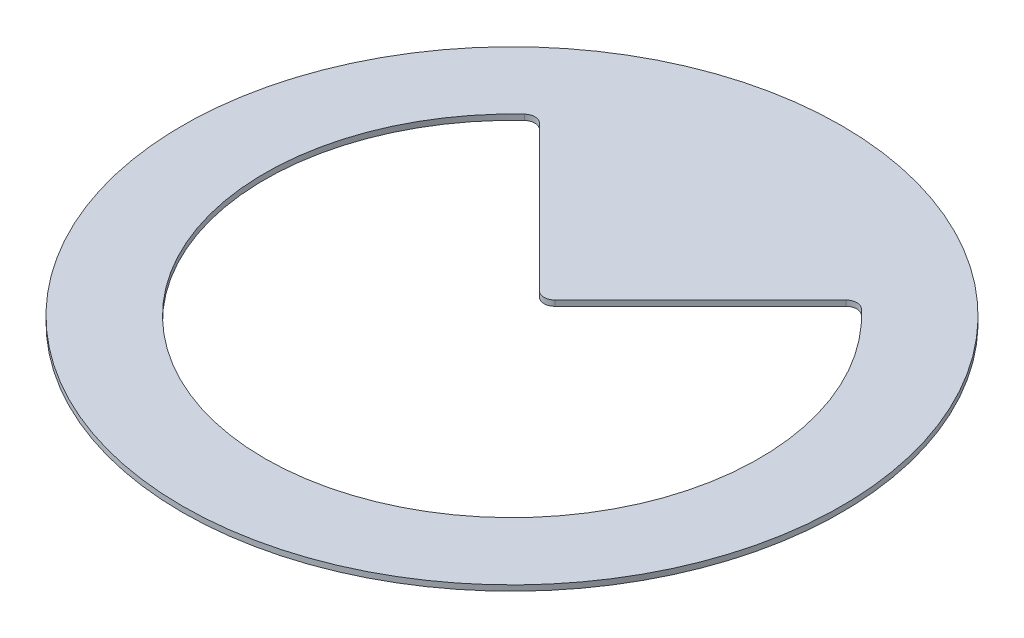
ISO-10303-21;
HEADER;
FILE_DESCRIPTION(('STEP AP214'),'2;1');
FILE_NAME('part.step','',(''),(''),'','','');
FILE_SCHEMA(('AUTOMOTIVE_DESIGN { 1 0 10303 214 1 1 1 1 }'));
ENDSEC;
DATA;
#1=APPLICATION_CONTEXT('core data for automotive mechanical design processes');
#2=APPLICATION_PROTOCOL_DEFINITION('international standard','automotive_design',2000,#1);
#3=PRODUCT_CONTEXT('',#1,'mechanical');
#4=PRODUCT('Part','Part','',(#3));
#5=PRODUCT_RELATED_PRODUCT_CATEGORY('part','',(#4));
#6=PRODUCT_DEFINITION_FORMATION('','',#4);
#7=PRODUCT_DEFINITION_CONTEXT('part definition',#1,'design');
#8=PRODUCT_DEFINITION('design','',#6,#7);
#9=PRODUCT_DEFINITION_SHAPE('','',#8);
#10=(LENGTH_UNIT() NAMED_UNIT(*) SI_UNIT(.MILLI.,.METRE.));
#11=(NAMED_UNIT(*) PLANE_ANGLE_UNIT() SI_UNIT($,.RADIAN.));
#12=(NAMED_UNIT(*) SI_UNIT($,.STERADIAN.) SOLID_ANGLE_UNIT());
#13=UNCERTAINTY_MEASURE_WITH_UNIT(LENGTH_MEASURE(1.E-05),#10,'distance_accuracy_value','');
#14=(GEOMETRIC_REPRESENTATION_CONTEXT(3) GLOBAL_UNCERTAINTY_ASSIGNED_CONTEXT((#13)) GLOBAL_UNIT_ASSIGNED_CONTEXT((#10,
#11,#12)) REPRESENTATION_CONTEXT('',''));
#15=CARTESIAN_POINT('',(0.,0.,0.));
#16=DIRECTION('',(0.,0.,1.));
#17=DIRECTION('',(1.,0.,0.));
#18=AXIS2_PLACEMENT_3D('',#15,#16,#17);
#19=CARTESIAN_POINT('',(0.,1.,0.));
#20=DIRECTION('',(0.,1.,0.));
#21=DIRECTION('',(0.,0.,1.));
#22=AXIS2_PLACEMENT_3D('',#19,#20,#21);
#23=PLANE('',#22);
#24=CARTESIAN_POINT('',(0.,1.,0.));
#25=DIRECTION('',(0.,1.,0.));
#26=DIRECTION('',(0.,0.,1.));
#27=AXIS2_PLACEMENT_3D('',#24,#25,#26);
#28=CIRCLE('',#27,60.);
#29=CARTESIAN_POINT('',(0.,1.,60.));
#30=VERTEX_POINT('',#29);
#31=EDGE_CURVE('E108',#30,#30,#28,.T.);
#32=ORIENTED_EDGE('',*,*,#31,.T.);
#33=EDGE_LOOP('',(#32));
#34=FACE_BOUND('',#33,.T.);
#35=DIRECTION('',(-0.707106781186547,0.,-0.707106781186548));
#36=VECTOR('',#35,1.);
#37=CARTESIAN_POINT('',(-29.2214438511238,1.,-34.2214438511238));
#38=LINE('',#37,#36);
#39=CARTESIAN_POINT('',(-1.41421356237309,1.,-6.4142135623731));
#40=VERTEX_POINT('',#39);
#41=CARTESIAN_POINT('',(-27.8861986403674,1.,-32.8861986403674));
#42=VERTEX_POINT('',#41);
#43=EDGE_CURVE('E145',#40,#42,#38,.T.);
#44=ORIENTED_EDGE('',*,*,#43,.F.);
#45=CARTESIAN_POINT('',(0.,1.,-7.82842712474619));
#46=DIRECTION('',(0.,1.,0.));
#47=DIRECTION('',(0.,0.,1.));
#48=AXIS2_PLACEMENT_3D('',#45,#46,#47);
#49=CIRCLE('',#48,2.);
#50=CARTESIAN_POINT('',(1.4142135623731,1.,-6.4142135623731));
#51=VERTEX_POINT('',#50);
#52=EDGE_CURVE('E50',#40,#51,#49,.T.);
#53=ORIENTED_EDGE('',*,*,#52,.T.);
#54=DIRECTION('',(-0.707106781186546,0.,0.707106781186549));
#55=VECTOR('',#54,1.);
#56=CARTESIAN_POINT('',(0.,1.,-5.));
#57=LINE('',#56,#55);
#58=CARTESIAN_POINT('',(27.8861986403674,1.,-32.8861986403674));
#59=VERTEX_POINT('',#58);
#60=EDGE_CURVE('E140',#59,#51,#57,.T.);
#61=ORIENTED_EDGE('',*,*,#60,.F.);
#62=CARTESIAN_POINT('',(29.3004122027405,1.,-31.4719850779943));
#63=DIRECTION('',(0.,1.,0.));
#64=DIRECTION('',(0.,0.,1.));
#65=AXIS2_PLACEMENT_3D('',#62,#63,#64);
#66=CIRCLE('',#65,2.);
#67=CARTESIAN_POINT('',(30.6632220726354,1.,-32.9357983374359));
#68=VERTEX_POINT('',#67);
#69=EDGE_CURVE('E11',#59,#68,#66,.F.);
#70=ORIENTED_EDGE('',*,*,#69,.T.);
#71=CARTESIAN_POINT('',(0.,1.,0.));
#72=DIRECTION('',(0.,1.,0.));
#73=DIRECTION('',(0.,0.,1.));
#74=AXIS2_PLACEMENT_3D('',#71,#72,#73);
#75=CIRCLE('',#74,45.);
#76=CARTESIAN_POINT('',(-30.6632220726354,1.,-32.935798337436));
#77=VERTEX_POINT('',#76);
#78=EDGE_CURVE('E106',#77,#68,#75,.T.);
#79=ORIENTED_EDGE('',*,*,#78,.F.);
#80=CARTESIAN_POINT('',(-29.3004122027405,1.,-31.4719850779944));
#81=DIRECTION('',(0.,1.,0.));
#82=DIRECTION('',(0.,0.,1.));
#83=AXIS2_PLACEMENT_3D('',#80,#81,#82);
#84=CIRCLE('',#83,2.);
#85=EDGE_CURVE('E127',#77,#42,#84,.F.);
#86=ORIENTED_EDGE('',*,*,#85,.T.);
#87=EDGE_LOOP('',(#44,#53,#61,#70,#79,#86));
#88=FACE_BOUND('',#87,.T.);
#89=ADVANCED_FACE('F35',(#34,#88),#23,.T.);
#90=CARTESIAN_POINT('',(0.,0.,0.));
#91=DIRECTION('',(0.,1.,0.));
#92=DIRECTION('',(0.,0.,1.));
#93=AXIS2_PLACEMENT_3D('',#90,#91,#92);
#94=PLANE('',#93);
#95=CARTESIAN_POINT('',(0.,0.,0.));
#96=DIRECTION('',(0.,1.,0.));
#97=DIRECTION('',(0.,0.,1.));
#98=AXIS2_PLACEMENT_3D('',#95,#96,#97);
#99=CIRCLE('',#98,60.);
#100=CARTESIAN_POINT('',(0.,0.,60.));
#101=VERTEX_POINT('',#100);
#102=EDGE_CURVE('E113',#101,#101,#99,.T.);
#103=ORIENTED_EDGE('',*,*,#102,.F.);
#104=EDGE_LOOP('',(#103));
#105=FACE_BOUND('',#104,.T.);
#106=DIRECTION('',(-0.707106781186546,0.,0.707106781186549));
#107=VECTOR('',#106,1.);
#108=CARTESIAN_POINT('',(0.,0.,-5.));
#109=LINE('',#108,#107);
#110=CARTESIAN_POINT('',(27.8861986403674,0.,-32.8861986403674));
#111=VERTEX_POINT('',#110);
#112=CARTESIAN_POINT('',(1.4142135623731,0.,-6.4142135623731));
#113=VERTEX_POINT('',#112);
#114=EDGE_CURVE('E93',#111,#113,#109,.T.);
#115=ORIENTED_EDGE('',*,*,#114,.T.);
#116=CARTESIAN_POINT('',(0.,0.,-7.82842712474619));
#117=DIRECTION('',(0.,1.,0.));
#118=DIRECTION('',(0.,0.,1.));
#119=AXIS2_PLACEMENT_3D('',#116,#117,#118);
#120=CIRCLE('',#119,2.);
#121=CARTESIAN_POINT('',(-1.41421356237309,0.,-6.4142135623731));
#122=VERTEX_POINT('',#121);
#123=EDGE_CURVE('E89',#113,#122,#120,.F.);
#124=ORIENTED_EDGE('',*,*,#123,.T.);
#125=DIRECTION('',(-0.707106781186547,0.,-0.707106781186548));
#126=VECTOR('',#125,1.);
#127=CARTESIAN_POINT('',(-29.2214438511238,0.,-34.2214438511238));
#128=LINE('',#127,#126);
#129=CARTESIAN_POINT('',(-27.8861986403674,0.,-32.8861986403674));
#130=VERTEX_POINT('',#129);
#131=EDGE_CURVE('E92',#122,#130,#128,.T.);
#132=ORIENTED_EDGE('',*,*,#131,.T.);
#133=CARTESIAN_POINT('',(-29.3004122027405,0.,-31.4719850779944));
#134=DIRECTION('',(0.,1.,0.));
#135=DIRECTION('',(0.,0.,1.));
#136=AXIS2_PLACEMENT_3D('',#133,#134,#135);
#137=CIRCLE('',#136,2.);
#138=CARTESIAN_POINT('',(-30.6632220726354,0.,-32.935798337436));
#139=VERTEX_POINT('',#138);
#140=EDGE_CURVE('E125',#130,#139,#137,.T.);
#141=ORIENTED_EDGE('',*,*,#140,.T.);
#142=CARTESIAN_POINT('',(0.,0.,0.));
#143=DIRECTION('',(0.,1.,0.));
#144=DIRECTION('',(0.,0.,1.));
#145=AXIS2_PLACEMENT_3D('',#142,#143,#144);
#146=CIRCLE('',#145,45.);
#147=CARTESIAN_POINT('',(30.6632220726354,0.,-32.9357983374359));
#148=VERTEX_POINT('',#147);
#149=EDGE_CURVE('E130',#139,#148,#146,.T.);
#150=ORIENTED_EDGE('',*,*,#149,.T.);
#151=CARTESIAN_POINT('',(29.3004122027405,0.,-31.4719850779943));
#152=DIRECTION('',(0.,1.,0.));
#153=DIRECTION('',(0.,0.,1.));
#154=AXIS2_PLACEMENT_3D('',#151,#152,#153);
#155=CIRCLE('',#154,2.);
#156=EDGE_CURVE('E43',#148,#111,#155,.T.);
#157=ORIENTED_EDGE('',*,*,#156,.T.);
#158=EDGE_LOOP('',(#115,#124,#132,#141,#150,#157));
#159=FACE_BOUND('',#158,.T.);
#160=ADVANCED_FACE('F91',(#105,#159),#94,.F.);
#161=CARTESIAN_POINT('',(0.,1.,0.));
#162=DIRECTION('',(0.,-1.,0.));
#163=DIRECTION('',(0.,0.,-1.));
#164=AXIS2_PLACEMENT_3D('',#161,#162,#163);
#165=CYLINDRICAL_SURFACE('',#164,60.);
#166=ORIENTED_EDGE('',*,*,#31,.F.);
#167=EDGE_LOOP('',(#166));
#168=FACE_BOUND('',#167,.T.);
#169=ORIENTED_EDGE('',*,*,#102,.T.);
#170=EDGE_LOOP('',(#169));
#171=FACE_BOUND('',#170,.T.);
#172=ADVANCED_FACE('F152',(#168,#171),#165,.T.);
#173=CARTESIAN_POINT('',(0.,1.,0.));
#174=DIRECTION('',(0.,-1.,0.));
#175=DIRECTION('',(0.,0.,-1.));
#176=AXIS2_PLACEMENT_3D('',#173,#174,#175);
#177=CYLINDRICAL_SURFACE('',#176,45.);
#178=ORIENTED_EDGE('',*,*,#149,.F.);
#179=DIRECTION('',(0.,-1.,0.));
#180=VECTOR('',#179,1.);
#181=CARTESIAN_POINT('',(-30.6632220726354,1.,-32.935798337436));
#182=LINE('',#181,#180);
#183=EDGE_CURVE('E119',#139,#77,#182,.F.);
#184=ORIENTED_EDGE('',*,*,#183,.T.);
#185=ORIENTED_EDGE('',*,*,#78,.T.);
#186=DIRECTION('',(0.,-1.,0.));
#187=VECTOR('',#186,1.);
#188=CARTESIAN_POINT('',(30.6632220726354,1.,-32.9357983374359));
#189=LINE('',#188,#187);
#190=EDGE_CURVE('E110',#68,#148,#189,.T.);
#191=ORIENTED_EDGE('',*,*,#190,.T.);
#192=EDGE_LOOP('',(#178,#184,#185,#191));
#193=FACE_BOUND('',#192,.T.);
#194=ADVANCED_FACE('F142',(#193),#177,.F.);
#195=CARTESIAN_POINT('',(0.,1.,-5.));
#196=DIRECTION('',(0.707106781186549,0.,0.707106781186546));
#197=DIRECTION('',(0.707106781186546,0.,-0.707106781186549));
#198=AXIS2_PLACEMENT_3D('',#195,#196,#197);
#199=PLANE('',#198);
#200=ORIENTED_EDGE('',*,*,#114,.F.);
#201=DIRECTION('',(0.,1.,0.));
#202=VECTOR('',#201,1.);
#203=CARTESIAN_POINT('',(27.8861986403674,1.,-32.8861986403674));
#204=LINE('',#203,#202);
#205=EDGE_CURVE('E57',#111,#59,#204,.T.);
#206=ORIENTED_EDGE('',*,*,#205,.T.);
#207=ORIENTED_EDGE('',*,*,#60,.T.);
#208=DIRECTION('',(0.,-1.,0.));
#209=VECTOR('',#208,1.);
#210=CARTESIAN_POINT('',(1.4142135623731,1.,-6.4142135623731));
#211=LINE('',#210,#209);
#212=EDGE_CURVE('E121',#51,#113,#211,.T.);
#213=ORIENTED_EDGE('',*,*,#212,.T.);
#214=EDGE_LOOP('',(#200,#206,#207,#213));
#215=FACE_BOUND('',#214,.T.);
#216=ADVANCED_FACE('F133',(#215),#199,.T.);
#217=CARTESIAN_POINT('',(-29.2214438511238,1.,-34.2214438511238));
#218=DIRECTION('',(-0.707106781186548,0.,0.707106781186547));
#219=DIRECTION('',(0.707106781186547,0.,0.707106781186548));
#220=AXIS2_PLACEMENT_3D('',#217,#218,#219);
#221=PLANE('',#220);
#222=ORIENTED_EDGE('',*,*,#43,.T.);
#223=DIRECTION('',(0.,1.,0.));
#224=VECTOR('',#223,1.);
#225=CARTESIAN_POINT('',(-27.8861986403674,0.,-32.8861986403674));
#226=LINE('',#225,#224);
#227=EDGE_CURVE('E105',#42,#130,#226,.F.);
#228=ORIENTED_EDGE('',*,*,#227,.T.);
#229=ORIENTED_EDGE('',*,*,#131,.F.);
#230=DIRECTION('',(0.,-1.,0.));
#231=VECTOR('',#230,1.);
#232=CARTESIAN_POINT('',(-1.41421356237309,1.,-6.4142135623731));
#233=LINE('',#232,#231);
#234=EDGE_CURVE('E103',#122,#40,#233,.F.);
#235=ORIENTED_EDGE('',*,*,#234,.T.);
#236=EDGE_LOOP('',(#222,#228,#229,#235));
#237=FACE_BOUND('',#236,.T.);
#238=ADVANCED_FACE('F102',(#237),#221,.T.);
#239=CARTESIAN_POINT('',(-29.3004122027405,1.,-31.4719850779944));
#240=DIRECTION('',(0.,-1.,0.));
#241=DIRECTION('',(0.,0.,-1.));
#242=AXIS2_PLACEMENT_3D('',#239,#240,#241);
#243=CYLINDRICAL_SURFACE('',#242,2.);
#244=ORIENTED_EDGE('',*,*,#85,.F.);
#245=ORIENTED_EDGE('',*,*,#183,.F.);
#246=ORIENTED_EDGE('',*,*,#140,.F.);
#247=ORIENTED_EDGE('',*,*,#227,.F.);
#248=EDGE_LOOP('',(#244,#245,#246,#247));
#249=FACE_BOUND('',#248,.T.);
#250=ADVANCED_FACE('F166',(#249),#243,.F.);
#251=CARTESIAN_POINT('',(29.3004122027405,1.,-31.4719850779943));
#252=DIRECTION('',(0.,-1.,0.));
#253=DIRECTION('',(0.,0.,-1.));
#254=AXIS2_PLACEMENT_3D('',#251,#252,#253);
#255=CYLINDRICAL_SURFACE('',#254,2.);
#256=ORIENTED_EDGE('',*,*,#69,.F.);
#257=ORIENTED_EDGE('',*,*,#205,.F.);
#258=ORIENTED_EDGE('',*,*,#156,.F.);
#259=ORIENTED_EDGE('',*,*,#190,.F.);
#260=EDGE_LOOP('',(#256,#257,#258,#259));
#261=FACE_BOUND('',#260,.T.);
#262=ADVANCED_FACE('F136',(#261),#255,.F.);
#263=CARTESIAN_POINT('',(0.,1.,-7.82842712474619));
#264=DIRECTION('',(0.,-1.,0.));
#265=DIRECTION('',(0.,0.,-1.));
#266=AXIS2_PLACEMENT_3D('',#263,#264,#265);
#267=CYLINDRICAL_SURFACE('',#266,2.);
#268=ORIENTED_EDGE('',*,*,#52,.F.);
#269=ORIENTED_EDGE('',*,*,#234,.F.);
#270=ORIENTED_EDGE('',*,*,#123,.F.);
#271=ORIENTED_EDGE('',*,*,#212,.F.);
#272=EDGE_LOOP('',(#268,#269,#270,#271));
#273=FACE_BOUND('',#272,.T.);
#274=ADVANCED_FACE('F37',(#273),#267,.T.);
#275=CLOSED_SHELL('',(#89,#160,#172,#194,#216,#238,#250,#262,#274));
#276=MANIFOLD_SOLID_BREP('B2',#275);
#277=ADVANCED_BREP_SHAPE_REPRESENTATION('',(#18,#276),#14);
#278=SHAPE_DEFINITION_REPRESENTATION(#9,#277);
ENDSEC;
END-ISO-10303-21;
